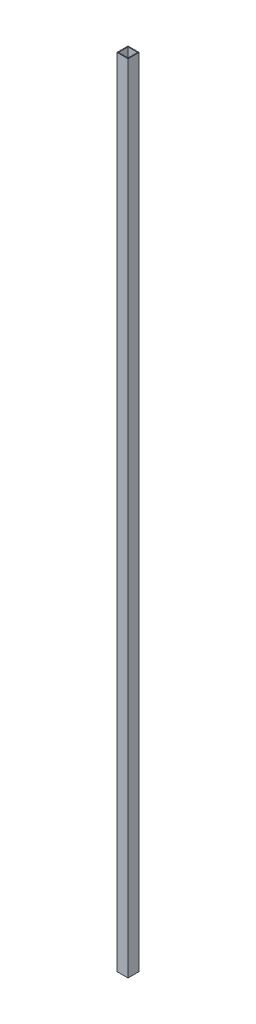
ISO-10303-21;
HEADER;
FILE_DESCRIPTION(('STEP AP214'),'2;1');
FILE_NAME('part.step','',(''),(''),'','','');
FILE_SCHEMA(('AUTOMOTIVE_DESIGN { 1 0 10303 214 1 1 1 1 }'));
ENDSEC;
DATA;
#1=APPLICATION_CONTEXT('core data for automotive mechanical design processes');
#2=APPLICATION_PROTOCOL_DEFINITION('international standard','automotive_design',2000,#1);
#3=PRODUCT_CONTEXT('',#1,'mechanical');
#4=PRODUCT('Part','Part','',(#3));
#5=PRODUCT_RELATED_PRODUCT_CATEGORY('part','',(#4));
#6=PRODUCT_DEFINITION_FORMATION('','',#4);
#7=PRODUCT_DEFINITION_CONTEXT('part definition',#1,'design');
#8=PRODUCT_DEFINITION('design','',#6,#7);
#9=PRODUCT_DEFINITION_SHAPE('','',#8);
#10=(LENGTH_UNIT() NAMED_UNIT(*) SI_UNIT(.MILLI.,.METRE.));
#11=(NAMED_UNIT(*) PLANE_ANGLE_UNIT() SI_UNIT($,.RADIAN.));
#12=(NAMED_UNIT(*) SI_UNIT($,.STERADIAN.) SOLID_ANGLE_UNIT());
#13=UNCERTAINTY_MEASURE_WITH_UNIT(LENGTH_MEASURE(1.E-05),#10,'distance_accuracy_value','');
#14=(GEOMETRIC_REPRESENTATION_CONTEXT(3) GLOBAL_UNCERTAINTY_ASSIGNED_CONTEXT((#13)) GLOBAL_UNIT_ASSIGNED_CONTEXT((#10,
#11,#12)) REPRESENTATION_CONTEXT('',''));
#15=CARTESIAN_POINT('',(0.,0.,0.));
#16=DIRECTION('',(0.,0.,1.));
#17=DIRECTION('',(1.,0.,0.));
#18=AXIS2_PLACEMENT_3D('',#15,#16,#17);
#19=CARTESIAN_POINT('',(0.,1828.8,0.));
#20=DIRECTION('',(0.,-1.,0.));
#21=DIRECTION('',(0.,0.,-1.));
#22=AXIS2_PLACEMENT_3D('',#19,#20,#21);
#23=PLANE('',#22);
#24=DIRECTION('',(0.,0.,-1.));
#25=VECTOR('',#24,1.);
#26=CARTESIAN_POINT('',(12.7,1828.8,12.7));
#27=LINE('',#26,#25);
#28=CARTESIAN_POINT('',(12.7,1828.8,12.7));
#29=VERTEX_POINT('',#28);
#30=CARTESIAN_POINT('',(12.7,1828.8,-12.7));
#31=VERTEX_POINT('',#30);
#32=EDGE_CURVE('E134',#29,#31,#27,.T.);
#33=ORIENTED_EDGE('',*,*,#32,.T.);
#34=DIRECTION('',(-1.,0.,0.));
#35=VECTOR('',#34,1.);
#36=CARTESIAN_POINT('',(-12.7,1828.8,-12.7));
#37=LINE('',#36,#35);
#38=CARTESIAN_POINT('',(-12.7,1828.8,-12.7));
#39=VERTEX_POINT('',#38);
#40=EDGE_CURVE('E137',#31,#39,#37,.T.);
#41=ORIENTED_EDGE('',*,*,#40,.T.);
#42=DIRECTION('',(0.,0.,1.));
#43=VECTOR('',#42,1.);
#44=CARTESIAN_POINT('',(-12.7,1828.8,12.7));
#45=LINE('',#44,#43);
#46=CARTESIAN_POINT('',(-12.7,1828.8,12.7));
#47=VERTEX_POINT('',#46);
#48=EDGE_CURVE('E140',#39,#47,#45,.T.);
#49=ORIENTED_EDGE('',*,*,#48,.T.);
#50=DIRECTION('',(1.,0.,0.));
#51=VECTOR('',#50,1.);
#52=CARTESIAN_POINT('',(-12.7,1828.8,12.7));
#53=LINE('',#52,#51);
#54=EDGE_CURVE('E142',#47,#29,#53,.T.);
#55=ORIENTED_EDGE('',*,*,#54,.T.);
#56=EDGE_LOOP('',(#33,#41,#49,#55));
#57=FACE_BOUND('',#56,.T.);
#58=DIRECTION('',(0.,0.,-1.));
#59=VECTOR('',#58,1.);
#60=CARTESIAN_POINT('',(11.1125,1828.8,11.1125));
#61=LINE('',#60,#59);
#62=CARTESIAN_POINT('',(11.1125,1828.8,11.1125));
#63=VERTEX_POINT('',#62);
#64=CARTESIAN_POINT('',(11.1125,1828.8,-11.1125));
#65=VERTEX_POINT('',#64);
#66=EDGE_CURVE('E98',#63,#65,#61,.T.);
#67=ORIENTED_EDGE('',*,*,#66,.F.);
#68=DIRECTION('',(1.,0.,0.));
#69=VECTOR('',#68,1.);
#70=CARTESIAN_POINT('',(-11.1125,1828.8,11.1125));
#71=LINE('',#70,#69);
#72=CARTESIAN_POINT('',(-11.1125,1828.8,11.1125));
#73=VERTEX_POINT('',#72);
#74=EDGE_CURVE('E120',#73,#63,#71,.T.);
#75=ORIENTED_EDGE('',*,*,#74,.F.);
#76=DIRECTION('',(0.,0.,1.));
#77=VECTOR('',#76,1.);
#78=CARTESIAN_POINT('',(-11.1125,1828.8,11.1125));
#79=LINE('',#78,#77);
#80=CARTESIAN_POINT('',(-11.1125,1828.8,-11.1125));
#81=VERTEX_POINT('',#80);
#82=EDGE_CURVE('E118',#81,#73,#79,.T.);
#83=ORIENTED_EDGE('',*,*,#82,.F.);
#84=DIRECTION('',(-1.,0.,0.));
#85=VECTOR('',#84,1.);
#86=CARTESIAN_POINT('',(-11.1125,1828.8,-11.1125));
#87=LINE('',#86,#85);
#88=EDGE_CURVE('E106',#65,#81,#87,.T.);
#89=ORIENTED_EDGE('',*,*,#88,.F.);
#90=EDGE_LOOP('',(#67,#75,#83,#89));
#91=FACE_BOUND('',#90,.T.);
#92=ADVANCED_FACE('F33',(#57,#91),#23,.F.);
#93=CARTESIAN_POINT('',(0.,0.,0.));
#94=DIRECTION('',(0.,-1.,0.));
#95=DIRECTION('',(0.,0.,-1.));
#96=AXIS2_PLACEMENT_3D('',#93,#94,#95);
#97=PLANE('',#96);
#98=DIRECTION('',(0.,0.,-1.));
#99=VECTOR('',#98,1.);
#100=CARTESIAN_POINT('',(12.7,0.,12.7));
#101=LINE('',#100,#99);
#102=CARTESIAN_POINT('',(12.7,0.,12.7));
#103=VERTEX_POINT('',#102);
#104=CARTESIAN_POINT('',(12.7,0.,-12.7));
#105=VERTEX_POINT('',#104);
#106=EDGE_CURVE('E114',#103,#105,#101,.T.);
#107=ORIENTED_EDGE('',*,*,#106,.F.);
#108=DIRECTION('',(1.,0.,0.));
#109=VECTOR('',#108,1.);
#110=CARTESIAN_POINT('',(-12.7,0.,12.7));
#111=LINE('',#110,#109);
#112=CARTESIAN_POINT('',(-12.7,0.,12.7));
#113=VERTEX_POINT('',#112);
#114=EDGE_CURVE('E138',#113,#103,#111,.T.);
#115=ORIENTED_EDGE('',*,*,#114,.F.);
#116=DIRECTION('',(0.,0.,1.));
#117=VECTOR('',#116,1.);
#118=CARTESIAN_POINT('',(-12.7,0.,12.7));
#119=LINE('',#118,#117);
#120=CARTESIAN_POINT('',(-12.7,0.,-12.7));
#121=VERTEX_POINT('',#120);
#122=EDGE_CURVE('E149',#121,#113,#119,.T.);
#123=ORIENTED_EDGE('',*,*,#122,.F.);
#124=DIRECTION('',(-1.,0.,0.));
#125=VECTOR('',#124,1.);
#126=CARTESIAN_POINT('',(-12.7,0.,-12.7));
#127=LINE('',#126,#125);
#128=EDGE_CURVE('E147',#105,#121,#127,.T.);
#129=ORIENTED_EDGE('',*,*,#128,.F.);
#130=EDGE_LOOP('',(#107,#115,#123,#129));
#131=FACE_BOUND('',#130,.T.);
#132=DIRECTION('',(1.,0.,0.));
#133=VECTOR('',#132,1.);
#134=CARTESIAN_POINT('',(-11.1125,0.,11.1125));
#135=LINE('',#134,#133);
#136=CARTESIAN_POINT('',(-11.1125,0.,11.1125));
#137=VERTEX_POINT('',#136);
#138=CARTESIAN_POINT('',(11.1125,0.,11.1125));
#139=VERTEX_POINT('',#138);
#140=EDGE_CURVE('E107',#137,#139,#135,.T.);
#141=ORIENTED_EDGE('',*,*,#140,.T.);
#142=DIRECTION('',(0.,0.,-1.));
#143=VECTOR('',#142,1.);
#144=CARTESIAN_POINT('',(11.1125,0.,11.1125));
#145=LINE('',#144,#143);
#146=CARTESIAN_POINT('',(11.1125,0.,-11.1125));
#147=VERTEX_POINT('',#146);
#148=EDGE_CURVE('E56',#139,#147,#145,.T.);
#149=ORIENTED_EDGE('',*,*,#148,.T.);
#150=DIRECTION('',(-1.,0.,0.));
#151=VECTOR('',#150,1.);
#152=CARTESIAN_POINT('',(-11.1125,0.,-11.1125));
#153=LINE('',#152,#151);
#154=CARTESIAN_POINT('',(-11.1125,0.,-11.1125));
#155=VERTEX_POINT('',#154);
#156=EDGE_CURVE('E113',#147,#155,#153,.T.);
#157=ORIENTED_EDGE('',*,*,#156,.T.);
#158=DIRECTION('',(0.,0.,1.));
#159=VECTOR('',#158,1.);
#160=CARTESIAN_POINT('',(-11.1125,0.,11.1125));
#161=LINE('',#160,#159);
#162=EDGE_CURVE('E126',#155,#137,#161,.T.);
#163=ORIENTED_EDGE('',*,*,#162,.T.);
#164=EDGE_LOOP('',(#141,#149,#157,#163));
#165=FACE_BOUND('',#164,.T.);
#166=ADVANCED_FACE('F167',(#131,#165),#97,.T.);
#167=CARTESIAN_POINT('',(12.7,1828.8,12.7));
#168=DIRECTION('',(-1.,0.,0.));
#169=DIRECTION('',(0.,0.,1.));
#170=AXIS2_PLACEMENT_3D('',#167,#168,#169);
#171=PLANE('',#170);
#172=ORIENTED_EDGE('',*,*,#106,.T.);
#173=DIRECTION('',(0.,-1.,0.));
#174=VECTOR('',#173,1.);
#175=CARTESIAN_POINT('',(12.7,1828.8,-12.7));
#176=LINE('',#175,#174);
#177=EDGE_CURVE('E11',#31,#105,#176,.T.);
#178=ORIENTED_EDGE('',*,*,#177,.F.);
#179=ORIENTED_EDGE('',*,*,#32,.F.);
#180=DIRECTION('',(0.,-1.,0.));
#181=VECTOR('',#180,1.);
#182=CARTESIAN_POINT('',(12.7,1828.8,12.7));
#183=LINE('',#182,#181);
#184=EDGE_CURVE('E144',#29,#103,#183,.T.);
#185=ORIENTED_EDGE('',*,*,#184,.T.);
#186=EDGE_LOOP('',(#172,#178,#179,#185));
#187=FACE_BOUND('',#186,.T.);
#188=ADVANCED_FACE('F35',(#187),#171,.F.);
#189=CARTESIAN_POINT('',(-12.7,1828.8,-12.7));
#190=DIRECTION('',(0.,0.,1.));
#191=DIRECTION('',(1.,0.,0.));
#192=AXIS2_PLACEMENT_3D('',#189,#190,#191);
#193=PLANE('',#192);
#194=ORIENTED_EDGE('',*,*,#128,.T.);
#195=DIRECTION('',(0.,-1.,0.));
#196=VECTOR('',#195,1.);
#197=CARTESIAN_POINT('',(-12.7,1828.8,-12.7));
#198=LINE('',#197,#196);
#199=EDGE_CURVE('E41',#39,#121,#198,.T.);
#200=ORIENTED_EDGE('',*,*,#199,.F.);
#201=ORIENTED_EDGE('',*,*,#40,.F.);
#202=ORIENTED_EDGE('',*,*,#177,.T.);
#203=EDGE_LOOP('',(#194,#200,#201,#202));
#204=FACE_BOUND('',#203,.T.);
#205=ADVANCED_FACE('F177',(#204),#193,.F.);
#206=CARTESIAN_POINT('',(-12.7,1828.8,12.7));
#207=DIRECTION('',(1.,0.,0.));
#208=DIRECTION('',(0.,0.,-1.));
#209=AXIS2_PLACEMENT_3D('',#206,#207,#208);
#210=PLANE('',#209);
#211=ORIENTED_EDGE('',*,*,#122,.T.);
#212=DIRECTION('',(0.,-1.,0.));
#213=VECTOR('',#212,1.);
#214=CARTESIAN_POINT('',(-12.7,1828.8,12.7));
#215=LINE('',#214,#213);
#216=EDGE_CURVE('E154',#47,#113,#215,.T.);
#217=ORIENTED_EDGE('',*,*,#216,.F.);
#218=ORIENTED_EDGE('',*,*,#48,.F.);
#219=ORIENTED_EDGE('',*,*,#199,.T.);
#220=EDGE_LOOP('',(#211,#217,#218,#219));
#221=FACE_BOUND('',#220,.T.);
#222=ADVANCED_FACE('F161',(#221),#210,.F.);
#223=CARTESIAN_POINT('',(-12.7,1828.8,12.7));
#224=DIRECTION('',(0.,0.,-1.));
#225=DIRECTION('',(-1.,0.,0.));
#226=AXIS2_PLACEMENT_3D('',#223,#224,#225);
#227=PLANE('',#226);
#228=ORIENTED_EDGE('',*,*,#114,.T.);
#229=ORIENTED_EDGE('',*,*,#184,.F.);
#230=ORIENTED_EDGE('',*,*,#54,.F.);
#231=ORIENTED_EDGE('',*,*,#216,.T.);
#232=EDGE_LOOP('',(#228,#229,#230,#231));
#233=FACE_BOUND('',#232,.T.);
#234=ADVANCED_FACE('F171',(#233),#227,.F.);
#235=CARTESIAN_POINT('',(11.1125,1828.8,11.1125));
#236=DIRECTION('',(-1.,0.,0.));
#237=DIRECTION('',(0.,0.,1.));
#238=AXIS2_PLACEMENT_3D('',#235,#236,#237);
#239=PLANE('',#238);
#240=ORIENTED_EDGE('',*,*,#148,.F.);
#241=DIRECTION('',(0.,-1.,0.));
#242=VECTOR('',#241,1.);
#243=CARTESIAN_POINT('',(11.1125,1828.8,11.1125));
#244=LINE('',#243,#242);
#245=EDGE_CURVE('E102',#63,#139,#244,.T.);
#246=ORIENTED_EDGE('',*,*,#245,.F.);
#247=ORIENTED_EDGE('',*,*,#66,.T.);
#248=DIRECTION('',(0.,-1.,0.));
#249=VECTOR('',#248,1.);
#250=CARTESIAN_POINT('',(11.1125,1828.8,-11.1125));
#251=LINE('',#250,#249);
#252=EDGE_CURVE('E101',#65,#147,#251,.T.);
#253=ORIENTED_EDGE('',*,*,#252,.T.);
#254=EDGE_LOOP('',(#240,#246,#247,#253));
#255=FACE_BOUND('',#254,.T.);
#256=ADVANCED_FACE('F100',(#255),#239,.T.);
#257=CARTESIAN_POINT('',(-11.1125,1828.8,-11.1125));
#258=DIRECTION('',(0.,0.,1.));
#259=DIRECTION('',(1.,0.,0.));
#260=AXIS2_PLACEMENT_3D('',#257,#258,#259);
#261=PLANE('',#260);
#262=ORIENTED_EDGE('',*,*,#156,.F.);
#263=ORIENTED_EDGE('',*,*,#252,.F.);
#264=ORIENTED_EDGE('',*,*,#88,.T.);
#265=DIRECTION('',(0.,-1.,0.));
#266=VECTOR('',#265,1.);
#267=CARTESIAN_POINT('',(-11.1125,1828.8,-11.1125));
#268=LINE('',#267,#266);
#269=EDGE_CURVE('E115',#81,#155,#268,.T.);
#270=ORIENTED_EDGE('',*,*,#269,.T.);
#271=EDGE_LOOP('',(#262,#263,#264,#270));
#272=FACE_BOUND('',#271,.T.);
#273=ADVANCED_FACE('F110',(#272),#261,.T.);
#274=CARTESIAN_POINT('',(-11.1125,1828.8,11.1125));
#275=DIRECTION('',(1.,0.,0.));
#276=DIRECTION('',(0.,0.,-1.));
#277=AXIS2_PLACEMENT_3D('',#274,#275,#276);
#278=PLANE('',#277);
#279=ORIENTED_EDGE('',*,*,#162,.F.);
#280=ORIENTED_EDGE('',*,*,#269,.F.);
#281=ORIENTED_EDGE('',*,*,#82,.T.);
#282=DIRECTION('',(0.,-1.,0.));
#283=VECTOR('',#282,1.);
#284=CARTESIAN_POINT('',(-11.1125,1828.8,11.1125));
#285=LINE('',#284,#283);
#286=EDGE_CURVE('E48',#73,#137,#285,.T.);
#287=ORIENTED_EDGE('',*,*,#286,.T.);
#288=EDGE_LOOP('',(#279,#280,#281,#287));
#289=FACE_BOUND('',#288,.T.);
#290=ADVANCED_FACE('F200',(#289),#278,.T.);
#291=CARTESIAN_POINT('',(-11.1125,1828.8,11.1125));
#292=DIRECTION('',(0.,0.,-1.));
#293=DIRECTION('',(-1.,0.,0.));
#294=AXIS2_PLACEMENT_3D('',#291,#292,#293);
#295=PLANE('',#294);
#296=ORIENTED_EDGE('',*,*,#140,.F.);
#297=ORIENTED_EDGE('',*,*,#286,.F.);
#298=ORIENTED_EDGE('',*,*,#74,.T.);
#299=ORIENTED_EDGE('',*,*,#245,.T.);
#300=EDGE_LOOP('',(#296,#297,#298,#299));
#301=FACE_BOUND('',#300,.T.);
#302=ADVANCED_FACE('F204',(#301),#295,.T.);
#303=CLOSED_SHELL('',(#92,#166,#188,#205,#222,#234,#256,#273,#290,#302));
#304=MANIFOLD_SOLID_BREP('B2',#303);
#305=ADVANCED_BREP_SHAPE_REPRESENTATION('',(#18,#304),#14);
#306=SHAPE_DEFINITION_REPRESENTATION(#9,#305);
ENDSEC;
END-ISO-10303-21;
